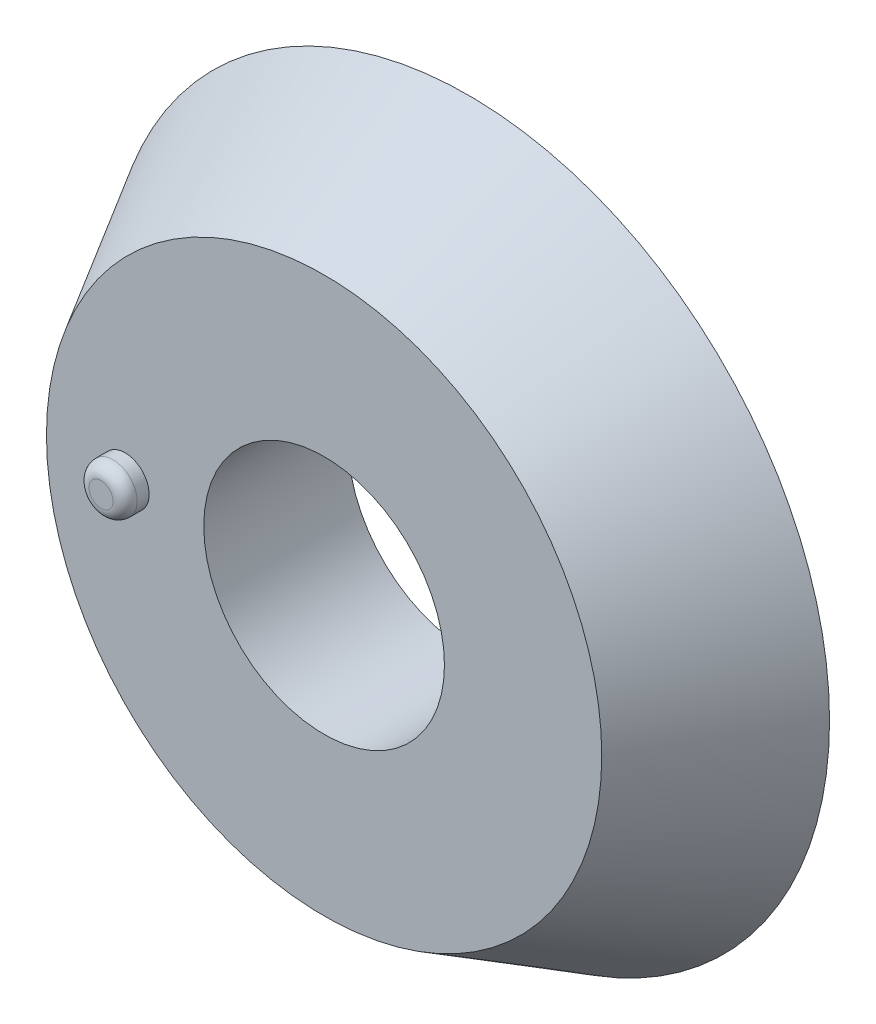
ISO-10303-21;
HEADER;
FILE_DESCRIPTION(('STEP AP214'),'2;1');
FILE_NAME('part.step','',(''),(''),'','','');
FILE_SCHEMA(('AUTOMOTIVE_DESIGN { 1 0 10303 214 1 1 1 1 }'));
ENDSEC;
DATA;
#1=APPLICATION_CONTEXT('core data for automotive mechanical design processes');
#2=APPLICATION_PROTOCOL_DEFINITION('international standard','automotive_design',2000,#1);
#3=PRODUCT_CONTEXT('',#1,'mechanical');
#4=PRODUCT('Part','Part','',(#3));
#5=PRODUCT_RELATED_PRODUCT_CATEGORY('part','',(#4));
#6=PRODUCT_DEFINITION_FORMATION('','',#4);
#7=PRODUCT_DEFINITION_CONTEXT('part definition',#1,'design');
#8=PRODUCT_DEFINITION('design','',#6,#7);
#9=PRODUCT_DEFINITION_SHAPE('','',#8);
#10=(LENGTH_UNIT() NAMED_UNIT(*) SI_UNIT(.MILLI.,.METRE.));
#11=(NAMED_UNIT(*) PLANE_ANGLE_UNIT() SI_UNIT($,.RADIAN.));
#12=(NAMED_UNIT(*) SI_UNIT($,.STERADIAN.) SOLID_ANGLE_UNIT());
#13=UNCERTAINTY_MEASURE_WITH_UNIT(LENGTH_MEASURE(1.E-05),#10,'distance_accuracy_value','');
#14=(GEOMETRIC_REPRESENTATION_CONTEXT(3) GLOBAL_UNCERTAINTY_ASSIGNED_CONTEXT((#13)) GLOBAL_UNIT_ASSIGNED_CONTEXT((#10,
#11,#12)) REPRESENTATION_CONTEXT('',''));
#15=CARTESIAN_POINT('',(0.,0.,0.));
#16=DIRECTION('',(0.,0.,1.));
#17=DIRECTION('',(1.,0.,0.));
#18=AXIS2_PLACEMENT_3D('',#15,#16,#17);
#19=CARTESIAN_POINT('',(0.,0.,0.));
#20=DIRECTION('',(0.,0.,-1.));
#21=DIRECTION('',(1.,0.,0.));
#22=AXIS2_PLACEMENT_3D('',#19,#20,#21);
#23=CONICAL_SURFACE('',#22,75.,0.5235987755983);
#24=CARTESIAN_POINT('',(0.,0.,30.));
#25=DIRECTION('',(0.,0.,1.));
#26=DIRECTION('',(1.,0.,0.));
#27=AXIS2_PLACEMENT_3D('',#24,#25,#26);
#28=CIRCLE('',#27,57.6794919243112);
#29=CARTESIAN_POINT('',(57.6794919243112,0.,30.));
#30=VERTEX_POINT('',#29);
#31=EDGE_CURVE('E52',#30,#30,#28,.T.);
#32=ORIENTED_EDGE('',*,*,#31,.F.);
#33=EDGE_LOOP('',(#32));
#34=FACE_BOUND('',#33,.T.);
#35=CARTESIAN_POINT('',(0.,0.,0.));
#36=DIRECTION('',(0.,0.,1.));
#37=DIRECTION('',(1.,0.,0.));
#38=AXIS2_PLACEMENT_3D('',#35,#36,#37);
#39=CIRCLE('',#38,75.);
#40=CARTESIAN_POINT('',(75.,0.,0.));
#41=VERTEX_POINT('',#40);
#42=EDGE_CURVE('E57',#41,#41,#39,.T.);
#43=ORIENTED_EDGE('',*,*,#42,.T.);
#44=EDGE_LOOP('',(#43));
#45=FACE_BOUND('',#44,.T.);
#46=ADVANCED_FACE('F39',(#34,#45),#23,.T.);
#47=CARTESIAN_POINT('',(0.,0.,30.));
#48=DIRECTION('',(0.,0.,1.));
#49=DIRECTION('',(1.,0.,0.));
#50=AXIS2_PLACEMENT_3D('',#47,#48,#49);
#51=PLANE('',#50);
#52=CARTESIAN_POINT('',(-41.3397459621556,0.,30.));
#53=DIRECTION('',(0.,0.,1.));
#54=DIRECTION('',(1.,0.,0.));
#55=AXIS2_PLACEMENT_3D('',#52,#53,#54);
#56=CIRCLE('',#55,5.);
#57=CARTESIAN_POINT('',(-36.3397459621556,0.,30.));
#58=VERTEX_POINT('',#57);
#59=EDGE_CURVE('E71',#58,#58,#56,.T.);
#60=ORIENTED_EDGE('',*,*,#59,.F.);
#61=EDGE_LOOP('',(#60));
#62=FACE_BOUND('',#61,.T.);
#63=CARTESIAN_POINT('',(0.,0.,30.));
#64=DIRECTION('',(0.,0.,1.));
#65=DIRECTION('',(1.,0.,0.));
#66=AXIS2_PLACEMENT_3D('',#63,#64,#65);
#67=CIRCLE('',#66,25.);
#68=CARTESIAN_POINT('',(25.,0.,30.));
#69=VERTEX_POINT('',#68);
#70=EDGE_CURVE('E63',#69,#69,#67,.T.);
#71=ORIENTED_EDGE('',*,*,#70,.F.);
#72=EDGE_LOOP('',(#71));
#73=FACE_BOUND('',#72,.T.);
#74=ORIENTED_EDGE('',*,*,#31,.T.);
#75=EDGE_LOOP('',(#74));
#76=FACE_BOUND('',#75,.T.);
#77=ADVANCED_FACE('F78',(#62,#73,#76),#51,.T.);
#78=CARTESIAN_POINT('',(0.,0.,0.));
#79=DIRECTION('',(0.,0.,1.));
#80=DIRECTION('',(1.,0.,0.));
#81=AXIS2_PLACEMENT_3D('',#78,#79,#80);
#82=PLANE('',#81);
#83=CARTESIAN_POINT('',(0.,0.,0.));
#84=DIRECTION('',(0.,0.,1.));
#85=DIRECTION('',(1.,0.,0.));
#86=AXIS2_PLACEMENT_3D('',#83,#84,#85);
#87=CIRCLE('',#86,25.);
#88=CARTESIAN_POINT('',(25.,0.,0.));
#89=VERTEX_POINT('',#88);
#90=EDGE_CURVE('E67',#89,#89,#87,.T.);
#91=ORIENTED_EDGE('',*,*,#90,.T.);
#92=EDGE_LOOP('',(#91));
#93=FACE_BOUND('',#92,.T.);
#94=ORIENTED_EDGE('',*,*,#42,.F.);
#95=EDGE_LOOP('',(#94));
#96=FACE_BOUND('',#95,.T.);
#97=ADVANCED_FACE('F81',(#93,#96),#82,.F.);
#98=CARTESIAN_POINT('',(0.,0.,0.));
#99=DIRECTION('',(0.,0.,1.));
#100=DIRECTION('',(1.,0.,0.));
#101=AXIS2_PLACEMENT_3D('',#98,#99,#100);
#102=CYLINDRICAL_SURFACE('',#101,25.);
#103=ORIENTED_EDGE('',*,*,#70,.T.);
#104=EDGE_LOOP('',(#103));
#105=FACE_BOUND('',#104,.T.);
#106=ORIENTED_EDGE('',*,*,#90,.F.);
#107=EDGE_LOOP('',(#106));
#108=FACE_BOUND('',#107,.T.);
#109=ADVANCED_FACE('F92',(#105,#108),#102,.F.);
#110=CARTESIAN_POINT('',(-41.3397459621556,0.,35.));
#111=DIRECTION('',(0.,0.,-1.));
#112=DIRECTION('',(-1.,0.,0.));
#113=AXIS2_PLACEMENT_3D('',#110,#111,#112);
#114=CYLINDRICAL_SURFACE('',#113,5.);
#115=CARTESIAN_POINT('',(-41.3397459621556,0.,32.5));
#116=DIRECTION('',(0.,0.,1.));
#117=DIRECTION('',(1.,0.,0.));
#118=AXIS2_PLACEMENT_3D('',#115,#116,#117);
#119=CIRCLE('',#118,5.);
#120=CARTESIAN_POINT('',(-36.3397459621556,0.,32.5));
#121=VERTEX_POINT('',#120);
#122=EDGE_CURVE('E10',#121,#121,#119,.F.);
#123=ORIENTED_EDGE('',*,*,#122,.T.);
#124=EDGE_LOOP('',(#123));
#125=FACE_BOUND('',#124,.T.);
#126=ORIENTED_EDGE('',*,*,#59,.T.);
#127=EDGE_LOOP('',(#126));
#128=FACE_BOUND('',#127,.T.);
#129=ADVANCED_FACE('F76',(#125,#128),#114,.T.);
#130=CARTESIAN_POINT('',(0.,0.,35.));
#131=DIRECTION('',(0.,0.,1.));
#132=DIRECTION('',(1.,0.,0.));
#133=AXIS2_PLACEMENT_3D('',#130,#131,#132);
#134=PLANE('',#133);
#135=CARTESIAN_POINT('',(-41.3397459621556,0.,35.));
#136=DIRECTION('',(0.,0.,1.));
#137=DIRECTION('',(1.,0.,0.));
#138=AXIS2_PLACEMENT_3D('',#135,#136,#137);
#139=CIRCLE('',#138,2.5);
#140=CARTESIAN_POINT('',(-38.8397459621556,0.,35.));
#141=VERTEX_POINT('',#140);
#142=EDGE_CURVE('E47',#141,#141,#139,.T.);
#143=ORIENTED_EDGE('',*,*,#142,.T.);
#144=EDGE_LOOP('',(#143));
#145=FACE_BOUND('',#144,.T.);
#146=ADVANCED_FACE('F103',(#145),#134,.T.);
#147=CARTESIAN_POINT('',(-41.3397459621556,0.,32.5));
#148=DIRECTION('',(0.,0.,1.));
#149=DIRECTION('',(1.,0.,0.));
#150=AXIS2_PLACEMENT_3D('',#147,#148,#149);
#151=DEGENERATE_TOROIDAL_SURFACE('',#150,2.5,2.5,.T.);
#152=ORIENTED_EDGE('',*,*,#122,.F.);
#153=EDGE_LOOP('',(#152));
#154=FACE_BOUND('',#153,.T.);
#155=ORIENTED_EDGE('',*,*,#142,.F.);
#156=EDGE_LOOP('',(#155));
#157=FACE_BOUND('',#156,.T.);
#158=ADVANCED_FACE('F41',(#154,#157),#151,.T.);
#159=CLOSED_SHELL('',(#46,#77,#97,#109,#129,#146,#158));
#160=MANIFOLD_SOLID_BREP('B2',#159);
#161=ADVANCED_BREP_SHAPE_REPRESENTATION('',(#18,#160),#14);
#162=SHAPE_DEFINITION_REPRESENTATION(#9,#161);
ENDSEC;
END-ISO-10303-21;
